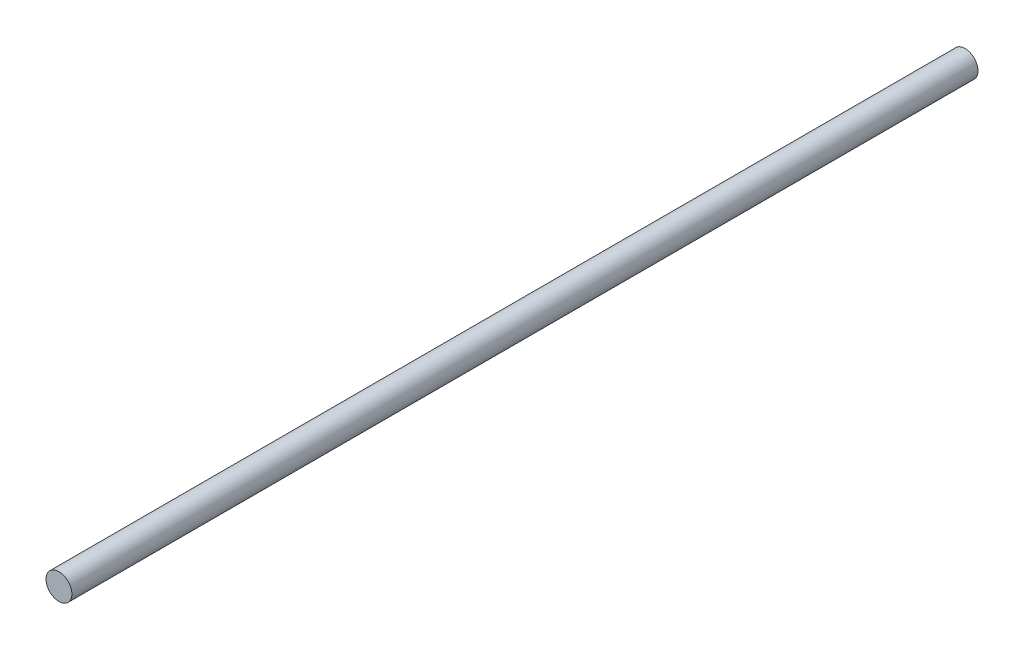
ISO-10303-21;
HEADER;
FILE_DESCRIPTION(('STEP AP214'),'2;1');
FILE_NAME('part.step','',(''),(''),'','','');
FILE_SCHEMA(('AUTOMOTIVE_DESIGN { 1 0 10303 214 1 1 1 1 }'));
ENDSEC;
DATA;
#1=APPLICATION_CONTEXT('core data for automotive mechanical design processes');
#2=APPLICATION_PROTOCOL_DEFINITION('international standard','automotive_design',2000,#1);
#3=PRODUCT_CONTEXT('',#1,'mechanical');
#4=PRODUCT('Part','Part','',(#3));
#5=PRODUCT_RELATED_PRODUCT_CATEGORY('part','',(#4));
#6=PRODUCT_DEFINITION_FORMATION('','',#4);
#7=PRODUCT_DEFINITION_CONTEXT('part definition',#1,'design');
#8=PRODUCT_DEFINITION('design','',#6,#7);
#9=PRODUCT_DEFINITION_SHAPE('','',#8);
#10=(LENGTH_UNIT() NAMED_UNIT(*) SI_UNIT(.MILLI.,.METRE.));
#11=(NAMED_UNIT(*) PLANE_ANGLE_UNIT() SI_UNIT($,.RADIAN.));
#12=(NAMED_UNIT(*) SI_UNIT($,.STERADIAN.) SOLID_ANGLE_UNIT());
#13=UNCERTAINTY_MEASURE_WITH_UNIT(LENGTH_MEASURE(1.E-05),#10,'distance_accuracy_value','');
#14=(GEOMETRIC_REPRESENTATION_CONTEXT(3) GLOBAL_UNCERTAINTY_ASSIGNED_CONTEXT((#13)) GLOBAL_UNIT_ASSIGNED_CONTEXT((#10,
#11,#12)) REPRESENTATION_CONTEXT('',''));
#15=CARTESIAN_POINT('',(0.,0.,0.));
#16=DIRECTION('',(0.,0.,1.));
#17=DIRECTION('',(1.,0.,0.));
#18=AXIS2_PLACEMENT_3D('',#15,#16,#17);
#19=CARTESIAN_POINT('',(0.,0.,700.));
#20=DIRECTION('',(0.,0.,-1.));
#21=DIRECTION('',(-1.,0.,0.));
#22=AXIS2_PLACEMENT_3D('',#19,#20,#21);
#23=CYLINDRICAL_SURFACE('',#22,10.);
#24=CARTESIAN_POINT('',(0.,0.,700.));
#25=DIRECTION('',(0.,0.,1.));
#26=DIRECTION('',(1.,0.,0.));
#27=AXIS2_PLACEMENT_3D('',#24,#25,#26);
#28=CIRCLE('',#27,10.);
#29=CARTESIAN_POINT('',(10.,0.,700.));
#30=VERTEX_POINT('',#29);
#31=EDGE_CURVE('E10',#30,#30,#28,.T.);
#32=ORIENTED_EDGE('',*,*,#31,.F.);
#33=EDGE_LOOP('',(#32));
#34=FACE_BOUND('',#33,.T.);
#35=CARTESIAN_POINT('',(0.,0.,0.));
#36=DIRECTION('',(0.,0.,1.));
#37=DIRECTION('',(1.,0.,0.));
#38=AXIS2_PLACEMENT_3D('',#35,#36,#37);
#39=CIRCLE('',#38,10.);
#40=CARTESIAN_POINT('',(10.,0.,0.));
#41=VERTEX_POINT('',#40);
#42=EDGE_CURVE('E34',#41,#41,#39,.T.);
#43=ORIENTED_EDGE('',*,*,#42,.T.);
#44=EDGE_LOOP('',(#43));
#45=FACE_BOUND('',#44,.T.);
#46=ADVANCED_FACE('F31',(#34,#45),#23,.T.);
#47=CARTESIAN_POINT('',(0.,0.,700.));
#48=DIRECTION('',(0.,0.,1.));
#49=DIRECTION('',(1.,0.,0.));
#50=AXIS2_PLACEMENT_3D('',#47,#48,#49);
#51=PLANE('',#50);
#52=ORIENTED_EDGE('',*,*,#31,.T.);
#53=EDGE_LOOP('',(#52));
#54=FACE_BOUND('',#53,.T.);
#55=ADVANCED_FACE('F46',(#54),#51,.T.);
#56=CARTESIAN_POINT('',(0.,0.,0.));
#57=DIRECTION('',(0.,0.,1.));
#58=DIRECTION('',(1.,0.,0.));
#59=AXIS2_PLACEMENT_3D('',#56,#57,#58);
#60=PLANE('',#59);
#61=ORIENTED_EDGE('',*,*,#42,.F.);
#62=EDGE_LOOP('',(#61));
#63=FACE_BOUND('',#62,.T.);
#64=ADVANCED_FACE('F44',(#63),#60,.F.);
#65=CLOSED_SHELL('',(#46,#55,#64));
#66=MANIFOLD_SOLID_BREP('B2',#65);
#67=ADVANCED_BREP_SHAPE_REPRESENTATION('',(#18,#66),#14);
#68=SHAPE_DEFINITION_REPRESENTATION(#9,#67);
ENDSEC;
END-ISO-10303-21;
